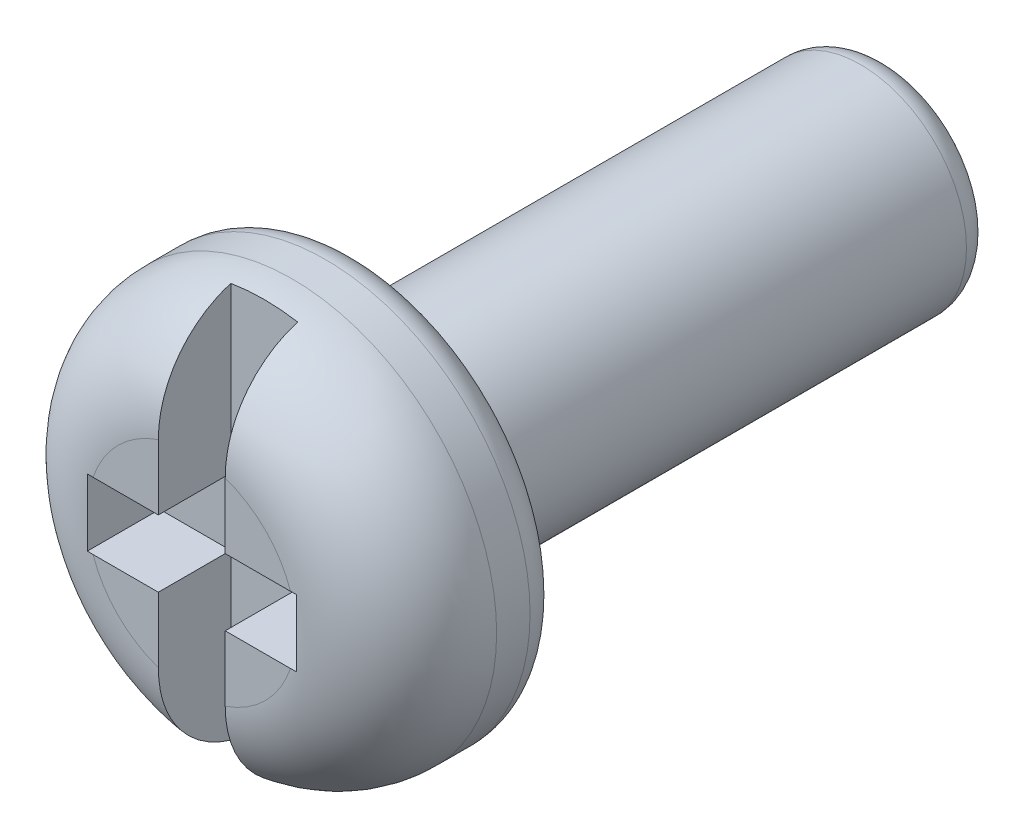
ISO-10303-21;
HEADER;
FILE_DESCRIPTION(('STEP AP214'),'2;1');
FILE_NAME('part.step','',(''),(''),'','','');
FILE_SCHEMA(('AUTOMOTIVE_DESIGN { 1 0 10303 214 1 1 1 1 }'));
ENDSEC;
DATA;
#1=APPLICATION_CONTEXT('core data for automotive mechanical design processes');
#2=APPLICATION_PROTOCOL_DEFINITION('international standard','automotive_design',2000,#1);
#3=PRODUCT_CONTEXT('',#1,'mechanical');
#4=PRODUCT('Part','Part','',(#3));
#5=PRODUCT_RELATED_PRODUCT_CATEGORY('part','',(#4));
#6=PRODUCT_DEFINITION_FORMATION('','',#4);
#7=PRODUCT_DEFINITION_CONTEXT('part definition',#1,'design');
#8=PRODUCT_DEFINITION('design','',#6,#7);
#9=PRODUCT_DEFINITION_SHAPE('','',#8);
#10=(LENGTH_UNIT() NAMED_UNIT(*) SI_UNIT(.MILLI.,.METRE.));
#11=(NAMED_UNIT(*) PLANE_ANGLE_UNIT() SI_UNIT($,.RADIAN.));
#12=(NAMED_UNIT(*) SI_UNIT($,.STERADIAN.) SOLID_ANGLE_UNIT());
#13=UNCERTAINTY_MEASURE_WITH_UNIT(LENGTH_MEASURE(1.E-05),#10,'distance_accuracy_value','');
#14=(GEOMETRIC_REPRESENTATION_CONTEXT(3) GLOBAL_UNCERTAINTY_ASSIGNED_CONTEXT((#13)) GLOBAL_UNIT_ASSIGNED_CONTEXT((#10,
#11,#12)) REPRESENTATION_CONTEXT('',''));
#15=CARTESIAN_POINT('',(0.,0.,0.));
#16=DIRECTION('',(0.,0.,1.));
#17=DIRECTION('',(1.,0.,0.));
#18=AXIS2_PLACEMENT_3D('',#15,#16,#17);
#19=CARTESIAN_POINT('',(2.38125,0.762,14.224));
#20=DIRECTION('',(0.,1.,0.));
#21=DIRECTION('',(-1.,0.,0.));
#22=AXIS2_PLACEMENT_3D('',#19,#20,#21);
#23=PLANE('',#22);
#24=DIRECTION('',(0.,0.,1.));
#25=VECTOR('',#24,1.);
#26=CARTESIAN_POINT('',(0.762000000000001,0.762,14.224));
#27=LINE('',#26,#25);
#28=CARTESIAN_POINT('',(0.762,0.762,15.875));
#29=VERTEX_POINT('',#28);
#30=CARTESIAN_POINT('',(0.762,0.762,14.224));
#31=VERTEX_POINT('',#30);
#32=EDGE_CURVE('E469',#29,#31,#27,.F.);
#33=ORIENTED_EDGE('',*,*,#32,.T.);
#34=DIRECTION('',(-1.,0.,0.));
#35=VECTOR('',#34,1.);
#36=CARTESIAN_POINT('',(-2.38125,0.762,14.224));
#37=LINE('',#36,#35);
#38=CARTESIAN_POINT('',(2.38125,0.762,14.224));
#39=VERTEX_POINT('',#38);
#40=EDGE_CURVE('E471',#31,#39,#37,.F.);
#41=ORIENTED_EDGE('',*,*,#40,.T.);
#42=DIRECTION('',(0.,0.,-1.));
#43=VECTOR('',#42,1.);
#44=CARTESIAN_POINT('',(2.38125,0.762,14.224));
#45=LINE('',#44,#43);
#46=CARTESIAN_POINT('',(2.38125,0.762,15.8715635006278));
#47=VERTEX_POINT('',#46);
#48=EDGE_CURVE('E653',#39,#47,#45,.F.);
#49=ORIENTED_EDGE('',*,*,#48,.T.);
#50=CARTESIAN_POINT('',(2.24933457048969,0.762,15.875));
#51=CARTESIAN_POINT('',(2.31552043281302,0.762,15.875));
#52=CARTESIAN_POINT('',(2.38125,0.762,15.8715635006278));
#53=B_SPLINE_CURVE_WITH_KNOTS('',2,(#50,#51,#52),.UNSPECIFIED.,.F.,.F.,(3,3),(0.,1.),.UNSPECIFIED.);
#54=CARTESIAN_POINT('',(2.24933457048969,0.762,15.875));
#55=VERTEX_POINT('',#54);
#56=EDGE_CURVE('E20',#55,#47,#53,.T.);
#57=ORIENTED_EDGE('',*,*,#56,.F.);
#58=DIRECTION('',(-1.,0.,0.));
#59=VECTOR('',#58,1.);
#60=CARTESIAN_POINT('',(-1.18745,0.762,15.875));
#61=LINE('',#60,#59);
#62=EDGE_CURVE('E473',#55,#29,#61,.T.);
#63=ORIENTED_EDGE('',*,*,#62,.T.);
#64=EDGE_LOOP('',(#33,#41,#49,#57,#63));
#65=FACE_BOUND('',#64,.T.);
#66=ADVANCED_FACE('F16',(#65),#23,.F.);
#67=CARTESIAN_POINT('',(-2.38125,-0.762,14.224));
#68=DIRECTION('',(0.,-1.,0.));
#69=DIRECTION('',(1.,0.,0.));
#70=AXIS2_PLACEMENT_3D('',#67,#68,#69);
#71=PLANE('',#70);
#72=DIRECTION('',(0.,0.,1.));
#73=VECTOR('',#72,1.);
#74=CARTESIAN_POINT('',(0.762000000000001,-0.762,14.224));
#75=LINE('',#74,#73);
#76=CARTESIAN_POINT('',(0.762000000000001,-0.762,14.224));
#77=VERTEX_POINT('',#76);
#78=CARTESIAN_POINT('',(0.762000000000001,-0.762,15.875));
#79=VERTEX_POINT('',#78);
#80=EDGE_CURVE('E566',#77,#79,#75,.T.);
#81=ORIENTED_EDGE('',*,*,#80,.T.);
#82=DIRECTION('',(-1.,0.,0.));
#83=VECTOR('',#82,1.);
#84=CARTESIAN_POINT('',(-1.18745,-0.762,15.875));
#85=LINE('',#84,#83);
#86=CARTESIAN_POINT('',(2.24933457048968,-0.762,15.875));
#87=VERTEX_POINT('',#86);
#88=EDGE_CURVE('E589',#79,#87,#85,.F.);
#89=ORIENTED_EDGE('',*,*,#88,.T.);
#90=CARTESIAN_POINT('',(2.38125,-0.762000000000003,15.8715635006272));
#91=CARTESIAN_POINT('',(2.31552043283485,-0.762000000000003,15.875));
#92=CARTESIAN_POINT('',(2.24933457048968,-0.762000000000002,15.875));
#93=B_SPLINE_CURVE_WITH_KNOTS('',2,(#90,#91,#92),.UNSPECIFIED.,.F.,.F.,(3,3),(0.,1.),.UNSPECIFIED.);
#94=CARTESIAN_POINT('',(2.38125,-0.762000000000001,15.8715635006272));
#95=VERTEX_POINT('',#94);
#96=EDGE_CURVE('E65',#95,#87,#93,.T.);
#97=ORIENTED_EDGE('',*,*,#96,.F.);
#98=DIRECTION('',(0.,0.,-1.));
#99=VECTOR('',#98,1.);
#100=CARTESIAN_POINT('',(2.38125,-0.762,14.224));
#101=LINE('',#100,#99);
#102=CARTESIAN_POINT('',(2.38125,-0.762,14.224));
#103=VERTEX_POINT('',#102);
#104=EDGE_CURVE('E586',#95,#103,#101,.T.);
#105=ORIENTED_EDGE('',*,*,#104,.T.);
#106=DIRECTION('',(-1.,0.,0.));
#107=VECTOR('',#106,1.);
#108=CARTESIAN_POINT('',(-2.38125,-0.762,14.224));
#109=LINE('',#108,#107);
#110=EDGE_CURVE('E574',#103,#77,#109,.T.);
#111=ORIENTED_EDGE('',*,*,#110,.T.);
#112=EDGE_LOOP('',(#81,#89,#97,#105,#111));
#113=FACE_BOUND('',#112,.T.);
#114=ADVANCED_FACE('F447',(#113),#71,.F.);
#115=CARTESIAN_POINT('',(-2.38125,0.762,14.224));
#116=DIRECTION('',(0.,0.,-1.));
#117=DIRECTION('',(-1.,0.,0.));
#118=AXIS2_PLACEMENT_3D('',#115,#116,#117);
#119=PLANE('',#118);
#120=DIRECTION('',(0.,1.,0.));
#121=VECTOR('',#120,1.);
#122=CARTESIAN_POINT('',(0.762,5.1054000087028,14.224));
#123=LINE('',#122,#121);
#124=CARTESIAN_POINT('',(0.762,4.50697297927666,14.224));
#125=VERTEX_POINT('',#124);
#126=EDGE_CURVE('E476',#31,#125,#123,.T.);
#127=ORIENTED_EDGE('',*,*,#126,.T.);
#128=CARTESIAN_POINT('',(0.,0.,14.224));
#129=DIRECTION('',(0.,0.,-1.));
#130=DIRECTION('',(-1.,0.,0.));
#131=AXIS2_PLACEMENT_3D('',#128,#129,#130);
#132=CIRCLE('',#131,4.5709352911554);
#133=CARTESIAN_POINT('',(-0.762,4.50697297927666,14.224));
#134=VERTEX_POINT('',#133);
#135=EDGE_CURVE('E485',#134,#125,#132,.T.);
#136=ORIENTED_EDGE('',*,*,#135,.F.);
#137=DIRECTION('',(0.,-1.,0.));
#138=VECTOR('',#137,1.);
#139=CARTESIAN_POINT('',(-0.762,5.1054000087028,14.224));
#140=LINE('',#139,#138);
#141=CARTESIAN_POINT('',(-0.762,0.762,14.224));
#142=VERTEX_POINT('',#141);
#143=EDGE_CURVE('E503',#134,#142,#140,.T.);
#144=ORIENTED_EDGE('',*,*,#143,.T.);
#145=DIRECTION('',(-1.,0.,0.));
#146=VECTOR('',#145,1.);
#147=CARTESIAN_POINT('',(2.38125,0.762,14.224));
#148=LINE('',#147,#146);
#149=CARTESIAN_POINT('',(-2.38125,0.762,14.224));
#150=VERTEX_POINT('',#149);
#151=EDGE_CURVE('E201',#142,#150,#148,.T.);
#152=ORIENTED_EDGE('',*,*,#151,.T.);
#153=DIRECTION('',(0.,1.,0.));
#154=VECTOR('',#153,1.);
#155=CARTESIAN_POINT('',(-2.38125,0.762,14.224));
#156=LINE('',#155,#154);
#157=CARTESIAN_POINT('',(-2.38125,-0.762,14.224));
#158=VERTEX_POINT('',#157);
#159=EDGE_CURVE('E206',#158,#150,#156,.T.);
#160=ORIENTED_EDGE('',*,*,#159,.F.);
#161=DIRECTION('',(1.,0.,0.));
#162=VECTOR('',#161,1.);
#163=CARTESIAN_POINT('',(-2.38125,-0.762,14.224));
#164=LINE('',#163,#162);
#165=CARTESIAN_POINT('',(-0.762,-0.762,14.224));
#166=VERTEX_POINT('',#165);
#167=EDGE_CURVE('E532',#158,#166,#164,.T.);
#168=ORIENTED_EDGE('',*,*,#167,.T.);
#169=DIRECTION('',(0.,-1.,0.));
#170=VECTOR('',#169,1.);
#171=CARTESIAN_POINT('',(-0.762,5.1054000087028,14.224));
#172=LINE('',#171,#170);
#173=CARTESIAN_POINT('',(-0.761999999999999,-4.50697297927666,14.224));
#174=VERTEX_POINT('',#173);
#175=EDGE_CURVE('E562',#166,#174,#172,.T.);
#176=ORIENTED_EDGE('',*,*,#175,.T.);
#177=CARTESIAN_POINT('',(0.,0.,14.224));
#178=DIRECTION('',(0.,0.,-1.));
#179=DIRECTION('',(-1.,0.,0.));
#180=AXIS2_PLACEMENT_3D('',#177,#178,#179);
#181=CIRCLE('',#180,4.5709352911554);
#182=CARTESIAN_POINT('',(0.762000000000001,-4.50697297927666,14.224));
#183=VERTEX_POINT('',#182);
#184=EDGE_CURVE('E152',#183,#174,#181,.T.);
#185=ORIENTED_EDGE('',*,*,#184,.F.);
#186=DIRECTION('',(0.,1.,0.));
#187=VECTOR('',#186,1.);
#188=CARTESIAN_POINT('',(0.762,5.1054000087028,14.224));
#189=LINE('',#188,#187);
#190=EDGE_CURVE('E568',#183,#77,#189,.T.);
#191=ORIENTED_EDGE('',*,*,#190,.T.);
#192=ORIENTED_EDGE('',*,*,#110,.F.);
#193=DIRECTION('',(0.,1.,0.));
#194=VECTOR('',#193,1.);
#195=CARTESIAN_POINT('',(2.38125,-0.762,14.224));
#196=LINE('',#195,#194);
#197=EDGE_CURVE('E483',#103,#39,#196,.T.);
#198=ORIENTED_EDGE('',*,*,#197,.T.);
#199=ORIENTED_EDGE('',*,*,#40,.F.);
#200=EDGE_LOOP('',(#127,#136,#144,#152,#160,#168,#176,#185,#191,#192,#198,#199));
#201=FACE_BOUND('',#200,.T.);
#202=ADVANCED_FACE('F438',(#201),#119,.F.);
#203=CARTESIAN_POINT('',(2.38125,0.762,14.224));
#204=DIRECTION('',(0.,1.,0.));
#205=DIRECTION('',(-1.,0.,0.));
#206=AXIS2_PLACEMENT_3D('',#203,#204,#205);
#207=PLANE('',#206);
#208=DIRECTION('',(0.,0.,1.));
#209=VECTOR('',#208,1.);
#210=CARTESIAN_POINT('',(-0.762,0.762,14.224));
#211=LINE('',#210,#209);
#212=CARTESIAN_POINT('',(-0.762,0.762,15.875));
#213=VERTEX_POINT('',#212);
#214=EDGE_CURVE('E500',#142,#213,#211,.T.);
#215=ORIENTED_EDGE('',*,*,#214,.T.);
#216=DIRECTION('',(-1.,0.,0.));
#217=VECTOR('',#216,1.);
#218=CARTESIAN_POINT('',(-1.18745,0.762,15.875));
#219=LINE('',#218,#217);
#220=CARTESIAN_POINT('',(-2.24933457048969,0.762,15.875));
#221=VERTEX_POINT('',#220);
#222=EDGE_CURVE('E505',#213,#221,#219,.T.);
#223=ORIENTED_EDGE('',*,*,#222,.T.);
#224=CARTESIAN_POINT('',(-2.38125,0.762,15.8715635006268));
#225=CARTESIAN_POINT('',(-2.31552043285017,0.762,15.875));
#226=CARTESIAN_POINT('',(-2.24933457048969,0.762,15.875));
#227=B_SPLINE_CURVE_WITH_KNOTS('',2,(#224,#225,#226),.UNSPECIFIED.,.F.,.F.,(3,3),(0.,1.),.UNSPECIFIED.);
#228=CARTESIAN_POINT('',(-2.38125,0.762,15.8715635006268));
#229=VERTEX_POINT('',#228);
#230=EDGE_CURVE('E36',#229,#221,#227,.T.);
#231=ORIENTED_EDGE('',*,*,#230,.F.);
#232=DIRECTION('',(0.,0.,1.));
#233=VECTOR('',#232,1.);
#234=CARTESIAN_POINT('',(-2.38125,0.762,14.224));
#235=LINE('',#234,#233);
#236=EDGE_CURVE('E138',#229,#150,#235,.F.);
#237=ORIENTED_EDGE('',*,*,#236,.T.);
#238=ORIENTED_EDGE('',*,*,#151,.F.);
#239=EDGE_LOOP('',(#215,#223,#231,#237,#238));
#240=FACE_BOUND('',#239,.T.);
#241=ADVANCED_FACE('F199',(#240),#207,.F.);
#242=CARTESIAN_POINT('',(-2.38125,-0.762,14.224));
#243=DIRECTION('',(0.,-1.,0.));
#244=DIRECTION('',(1.,0.,0.));
#245=AXIS2_PLACEMENT_3D('',#242,#243,#244);
#246=PLANE('',#245);
#247=DIRECTION('',(0.,0.,1.));
#248=VECTOR('',#247,1.);
#249=CARTESIAN_POINT('',(-0.761999999999999,-0.762,14.224));
#250=LINE('',#249,#248);
#251=CARTESIAN_POINT('',(-0.762,-0.762,15.875));
#252=VERTEX_POINT('',#251);
#253=EDGE_CURVE('E135',#252,#166,#250,.F.);
#254=ORIENTED_EDGE('',*,*,#253,.T.);
#255=ORIENTED_EDGE('',*,*,#167,.F.);
#256=DIRECTION('',(0.,0.,1.));
#257=VECTOR('',#256,1.);
#258=CARTESIAN_POINT('',(-2.38125,-0.762,14.224));
#259=LINE('',#258,#257);
#260=CARTESIAN_POINT('',(-2.38125,-0.762,15.8715635006278));
#261=VERTEX_POINT('',#260);
#262=EDGE_CURVE('E191',#158,#261,#259,.T.);
#263=ORIENTED_EDGE('',*,*,#262,.T.);
#264=CARTESIAN_POINT('',(-2.24933457048969,-0.762,15.875));
#265=CARTESIAN_POINT('',(-2.31552043281302,-0.762,15.875));
#266=CARTESIAN_POINT('',(-2.38125,-0.762,15.8715635006278));
#267=B_SPLINE_CURVE_WITH_KNOTS('',2,(#264,#265,#266),.UNSPECIFIED.,.F.,.F.,(3,3),(0.,1.),.UNSPECIFIED.);
#268=CARTESIAN_POINT('',(-2.24933457048969,-0.762,15.875));
#269=VERTEX_POINT('',#268);
#270=EDGE_CURVE('E208',#269,#261,#267,.T.);
#271=ORIENTED_EDGE('',*,*,#270,.F.);
#272=DIRECTION('',(-1.,0.,0.));
#273=VECTOR('',#272,1.);
#274=CARTESIAN_POINT('',(-1.18745,-0.762,15.875));
#275=LINE('',#274,#273);
#276=EDGE_CURVE('E139',#269,#252,#275,.F.);
#277=ORIENTED_EDGE('',*,*,#276,.T.);
#278=EDGE_LOOP('',(#254,#255,#263,#271,#277));
#279=FACE_BOUND('',#278,.T.);
#280=ADVANCED_FACE('F419',(#279),#246,.F.);
#281=CARTESIAN_POINT('',(-1.18745,0.,15.875));
#282=DIRECTION('',(0.,0.,-1.));
#283=DIRECTION('',(-1.,0.,0.));
#284=AXIS2_PLACEMENT_3D('',#281,#282,#283);
#285=PLANE('',#284);
#286=DIRECTION('',(0.,-1.,0.));
#287=VECTOR('',#286,1.);
#288=CARTESIAN_POINT('',(-0.762,5.1054000087028,15.875));
#289=LINE('',#288,#287);
#290=CARTESIAN_POINT('',(-0.762,2.24933457048969,15.875));
#291=VERTEX_POINT('',#290);
#292=EDGE_CURVE('E477',#213,#291,#289,.F.);
#293=ORIENTED_EDGE('',*,*,#292,.T.);
#294=CARTESIAN_POINT('',(0.,0.,15.875));
#295=DIRECTION('',(0.,0.,-1.));
#296=DIRECTION('',(-0.947128119284889,0.320855614973261,0.));
#297=AXIS2_PLACEMENT_3D('',#294,#295,#296);
#298=CIRCLE('',#297,2.37490000000001);
#299=EDGE_CURVE('E194',#221,#291,#298,.T.);
#300=ORIENTED_EDGE('',*,*,#299,.F.);
#301=ORIENTED_EDGE('',*,*,#222,.F.);
#302=EDGE_LOOP('',(#293,#300,#301));
#303=FACE_BOUND('',#302,.T.);
#304=ADVANCED_FACE('F409',(#303),#285,.F.);
#305=CARTESIAN_POINT('',(-0.762,5.1054000087028,14.224));
#306=DIRECTION('',(-1.,0.,0.));
#307=DIRECTION('',(0.,-1.,0.));
#308=AXIS2_PLACEMENT_3D('',#305,#306,#307);
#309=PLANE('',#308);
#310=ORIENTED_EDGE('',*,*,#214,.F.);
#311=ORIENTED_EDGE('',*,*,#143,.F.);
#312=CARTESIAN_POINT('',(-0.762,2.24933457048969,15.875));
#313=CARTESIAN_POINT('',(-0.761999999999998,2.31857015286448,15.8750120063341));
#314=CARTESIAN_POINT('',(-0.761999999999999,2.38781373559717,15.8721780318991));
#315=CARTESIAN_POINT('',(-0.762,2.52584179413332,15.8607469620337));
#316=CARTESIAN_POINT('',(-0.762000000000001,2.59462613415144,15.8521482322549));
#317=CARTESIAN_POINT('',(-0.761999999999998,2.73128839722187,15.8291050021387));
#318=CARTESIAN_POINT('',(-0.761999999999994,2.79916535521893,15.814654721312));
#319=CARTESIAN_POINT('',(-0.762000000000005,2.93338925925472,15.7799454931923));
#320=CARTESIAN_POINT('',(-0.76200000000002,2.999736388021,15.7596872435449));
#321=CARTESIAN_POINT('',(-0.762000000000036,3.19486590753159,15.6905844293292));
#322=CARTESIAN_POINT('',(-0.762000000000009,3.32076412595768,15.6332392729572));
#323=CARTESIAN_POINT('',(-0.76199999999999,3.56028532532934,15.4972791539692));
#324=CARTESIAN_POINT('',(-0.761999999999998,3.67391984980217,15.4186844417406));
#325=CARTESIAN_POINT('',(-0.762000000000003,3.88037191248349,15.2466129224533));
#326=CARTESIAN_POINT('',(-0.762000000000001,3.9739159123031,15.1540071749996));
#327=CARTESIAN_POINT('',(-0.761999999999999,4.14372667341,14.9540889309037));
#328=CARTESIAN_POINT('',(-0.761999999999999,4.21999715174322,14.8467796062797));
#329=CARTESIAN_POINT('',(-0.762,4.33347482681577,14.6536749411664));
#330=CARTESIAN_POINT('',(-0.762,4.37558906742209,14.5707191927778));
#331=CARTESIAN_POINT('',(-0.762,4.44928763424628,14.4003927815324));
#332=CARTESIAN_POINT('',(-0.762,4.48088644294263,14.3130283832416));
#333=CARTESIAN_POINT('',(-0.761999999999999,4.50697297927666,14.224));
#334=B_SPLINE_CURVE_WITH_KNOTS('',3,(#312,#313,#314,#315,#316,#317,#318,#319,#320,#321,#322,
#323,#324,#325,#326,#327,#328,#329,#330,#331,#332,#333),.UNSPECIFIED.,.F.,.F.,(4,2,2,2,2,2,2,2,
2,2,4),(0.,0.207658951127346,0.415376799928397,0.623300346562895,0.831198928149645,
1.24391190440976,1.65623295165278,2.04921222065782,2.44210684491622,2.72054351489304,
2.9985951027217),.UNSPECIFIED.);
#335=EDGE_CURVE('E629',#291,#134,#334,.T.);
#336=ORIENTED_EDGE('',*,*,#335,.F.);
#337=ORIENTED_EDGE('',*,*,#292,.F.);
#338=EDGE_LOOP('',(#310,#311,#336,#337));
#339=FACE_BOUND('',#338,.T.);
#340=ADVANCED_FACE('F399',(#339),#309,.F.);
#341=CARTESIAN_POINT('',(0.762,5.1054000087028,14.224));
#342=DIRECTION('',(1.,0.,0.));
#343=DIRECTION('',(0.,1.,0.));
#344=AXIS2_PLACEMENT_3D('',#341,#342,#343);
#345=PLANE('',#344);
#346=ORIENTED_EDGE('',*,*,#32,.F.);
#347=DIRECTION('',(0.,1.,0.));
#348=VECTOR('',#347,1.);
#349=CARTESIAN_POINT('',(0.762,0.,15.875));
#350=LINE('',#349,#348);
#351=CARTESIAN_POINT('',(0.762,2.24933457048969,15.875));
#352=VERTEX_POINT('',#351);
#353=EDGE_CURVE('E490',#29,#352,#350,.T.);
#354=ORIENTED_EDGE('',*,*,#353,.T.);
#355=CARTESIAN_POINT('',(0.762000000000001,4.50697297927666,14.224));
#356=CARTESIAN_POINT('',(0.762,4.48899482082664,14.2853274901749));
#357=CARTESIAN_POINT('',(0.762,4.46840287735233,14.3458847021477));
#358=CARTESIAN_POINT('',(0.762,4.42217393073777,14.4650361233278));
#359=CARTESIAN_POINT('',(0.762,4.39653735872725,14.5236304997848));
#360=CARTESIAN_POINT('',(0.762,4.3404209641194,14.638398546594));
#361=CARTESIAN_POINT('',(0.762,4.30994502843977,14.6945741140621));
#362=CARTESIAN_POINT('',(0.762,4.24438025078716,14.8041445333258));
#363=CARTESIAN_POINT('',(0.762000000000001,4.2092914278917,14.8575393966204));
#364=CARTESIAN_POINT('',(0.762000000000001,4.09745185862946,15.0130115466413));
#365=CARTESIAN_POINT('',(0.762,4.01409082578964,15.1104521991613));
#366=CARTESIAN_POINT('',(0.762000000000001,3.83238605029267,15.2899905473715));
#367=CARTESIAN_POINT('',(0.762000000000002,3.73404782650669,15.3720938699274));
#368=CARTESIAN_POINT('',(0.762000000000003,3.52434838325627,15.5195331992913));
#369=CARTESIAN_POINT('',(0.762000000000001,3.41289111019372,15.5847327073837));
#370=CARTESIAN_POINT('',(0.762,3.18073308594454,15.6959797700354));
#371=CARTESIAN_POINT('',(0.762000000000001,3.06002636532825,15.742014830815));
#372=CARTESIAN_POINT('',(0.762000000000001,2.82488469403238,15.8105081654999));
#373=CARTESIAN_POINT('',(0.762,2.71099085898578,15.8348318927297));
#374=CARTESIAN_POINT('',(0.762,2.53860890318799,15.8590162958514));
#375=CARTESIAN_POINT('',(0.762,2.48092060869738,15.8650276290919));
#376=CARTESIAN_POINT('',(0.762,2.36527087737749,15.873020431787));
#377=CARTESIAN_POINT('',(0.762000000000001,2.30730947069498,15.8750023360373));
#378=CARTESIAN_POINT('',(0.762000000000001,2.24933457048969,15.875));
#379=B_SPLINE_CURVE_WITH_KNOTS('',3,(#355,#356,#357,#358,#359,#360,#361,#362,#363,#364,#365,
#366,#367,#368,#369,#370,#371,#372,#373,#374,#375,#376,#377,#378),.UNSPECIFIED.,.F.,.F.,(4,2,2,
2,2,2,2,2,2,2,2,4),(0.,0.191660933878234,0.383305494922878,0.574796900806049,0.766287514762521,
1.1490186275538,1.53160904934273,1.91719890439149,2.30303974288341,2.65114636519203,
2.82502590749426,2.99888668632189),.UNSPECIFIED.);
#380=EDGE_CURVE('E488',#125,#352,#379,.T.);
#381=ORIENTED_EDGE('',*,*,#380,.F.);
#382=ORIENTED_EDGE('',*,*,#126,.F.);
#383=EDGE_LOOP('',(#346,#354,#381,#382));
#384=FACE_BOUND('',#383,.T.);
#385=ADVANCED_FACE('F389',(#384),#345,.F.);
#386=CARTESIAN_POINT('',(-1.18745,0.,15.875));
#387=DIRECTION('',(0.,0.,-1.));
#388=DIRECTION('',(-1.,0.,0.));
#389=AXIS2_PLACEMENT_3D('',#386,#387,#388);
#390=PLANE('',#389);
#391=ORIENTED_EDGE('',*,*,#353,.F.);
#392=ORIENTED_EDGE('',*,*,#62,.F.);
#393=CARTESIAN_POINT('',(0.,0.,15.875));
#394=DIRECTION('',(0.,0.,-1.));
#395=DIRECTION('',(0.320855614973261,0.947128119284889,0.));
#396=AXIS2_PLACEMENT_3D('',#393,#394,#395);
#397=CIRCLE('',#396,2.37490000000001);
#398=EDGE_CURVE('E623',#352,#55,#397,.T.);
#399=ORIENTED_EDGE('',*,*,#398,.F.);
#400=EDGE_LOOP('',(#391,#392,#399));
#401=FACE_BOUND('',#400,.T.);
#402=ADVANCED_FACE('F379',(#401),#390,.F.);
#403=CARTESIAN_POINT('',(2.38125,-0.762,14.224));
#404=DIRECTION('',(1.,0.,0.));
#405=DIRECTION('',(0.,0.,-1.));
#406=AXIS2_PLACEMENT_3D('',#403,#404,#405);
#407=PLANE('',#406);
#408=ORIENTED_EDGE('',*,*,#48,.F.);
#409=ORIENTED_EDGE('',*,*,#197,.F.);
#410=ORIENTED_EDGE('',*,*,#104,.F.);
#411=CARTESIAN_POINT('',(2.38125,0.761999999999982,15.8715635006268));
#412=CARTESIAN_POINT('',(2.38125,0.69850454019341,15.8726141738095));
#413=CARTESIAN_POINT('',(2.38125,0.635005433680503,15.8733198631581));
#414=CARTESIAN_POINT('',(2.38125,0.508005084788024,15.8742859278826));
#415=CARTESIAN_POINT('',(2.38125,0.444503842497386,15.8745463140397));
#416=CARTESIAN_POINT('',(2.38125,0.317502433039196,15.8748664504141));
#417=CARTESIAN_POINT('',(2.38125,0.254002265872591,15.8749262041967));
#418=CARTESIAN_POINT('',(2.38125,0.127001399137652,15.8749885694779));
#419=CARTESIAN_POINT('',(2.38125,0.0635006995688236,15.8749911805584));
#420=CARTESIAN_POINT('',(2.38125,-0.0635006995688343,15.8749911805584));
#421=CARTESIAN_POINT('',(2.38125,-0.127001399137663,15.8749885694779));
#422=CARTESIAN_POINT('',(2.38125,-0.254002265872601,15.8749262041967));
#423=CARTESIAN_POINT('',(2.38125,-0.317502433039207,15.8748664504141));
#424=CARTESIAN_POINT('',(2.38125,-0.444503842497397,15.8745463140397));
#425=CARTESIAN_POINT('',(2.38125,-0.508005084788035,15.8742859278826));
#426=CARTESIAN_POINT('',(2.38125,-0.635005433680514,15.8733198631581));
#427=CARTESIAN_POINT('',(2.38125,-0.69850454019342,15.8726141738095));
#428=CARTESIAN_POINT('',(2.38125,-0.761999999999993,15.8715635006268));
#429=B_SPLINE_CURVE_WITH_KNOTS('',3,(#411,#412,#413,#414,#415,#416,#417,#418,#419,#420,#421,
#422,#423,#424,#425,#426,#427,#428),.UNSPECIFIED.,.F.,.F.,(4,2,2,2,2,2,2,2,4),(0.,
0.190508671850208,0.381012731235381,0.571513405382453,0.762015473155972,0.952517540929491,
1.14301821507656,1.33352227446174,1.52403094631194),.UNSPECIFIED.);
#430=EDGE_CURVE('E618',#47,#95,#429,.T.);
#431=ORIENTED_EDGE('',*,*,#430,.F.);
#432=EDGE_LOOP('',(#408,#409,#410,#431));
#433=FACE_BOUND('',#432,.T.);
#434=ADVANCED_FACE('F369',(#433),#407,.F.);
#435=CARTESIAN_POINT('',(-1.18745,0.,15.875));
#436=DIRECTION('',(0.,0.,-1.));
#437=DIRECTION('',(-1.,0.,0.));
#438=AXIS2_PLACEMENT_3D('',#435,#436,#437);
#439=PLANE('',#438);
#440=DIRECTION('',(0.,1.,0.));
#441=VECTOR('',#440,1.);
#442=CARTESIAN_POINT('',(0.762,5.1054000087028,15.875));
#443=LINE('',#442,#441);
#444=CARTESIAN_POINT('',(0.762,-2.24933457048969,15.875));
#445=VERTEX_POINT('',#444);
#446=EDGE_CURVE('E563',#79,#445,#443,.F.);
#447=ORIENTED_EDGE('',*,*,#446,.T.);
#448=CARTESIAN_POINT('',(0.,0.,15.875));
#449=DIRECTION('',(0.,0.,-1.));
#450=DIRECTION('',(0.947128119284889,-0.320855614973262,0.));
#451=AXIS2_PLACEMENT_3D('',#448,#449,#450);
#452=CIRCLE('',#451,2.3749);
#453=EDGE_CURVE('E156',#87,#445,#452,.T.);
#454=ORIENTED_EDGE('',*,*,#453,.F.);
#455=ORIENTED_EDGE('',*,*,#88,.F.);
#456=EDGE_LOOP('',(#447,#454,#455));
#457=FACE_BOUND('',#456,.T.);
#458=ADVANCED_FACE('F360',(#457),#439,.F.);
#459=CARTESIAN_POINT('',(0.762,5.1054000087028,14.224));
#460=DIRECTION('',(1.,0.,0.));
#461=DIRECTION('',(0.,1.,0.));
#462=AXIS2_PLACEMENT_3D('',#459,#460,#461);
#463=PLANE('',#462);
#464=ORIENTED_EDGE('',*,*,#80,.F.);
#465=ORIENTED_EDGE('',*,*,#190,.F.);
#466=CARTESIAN_POINT('',(0.762000000000002,-2.24933457048969,15.875));
#467=CARTESIAN_POINT('',(0.762,-2.31857015286448,15.8750120063341));
#468=CARTESIAN_POINT('',(0.762,-2.38781373559717,15.8721780318991));
#469=CARTESIAN_POINT('',(0.762000000000002,-2.52584179413332,15.8607469620337));
#470=CARTESIAN_POINT('',(0.762000000000002,-2.59462613415144,15.8521482322549));
#471=CARTESIAN_POINT('',(0.762,-2.73128839722187,15.8291050021387));
#472=CARTESIAN_POINT('',(0.761999999999996,-2.79916535521893,15.814654721312));
#473=CARTESIAN_POINT('',(0.762000000000006,-2.93338925925472,15.7799454931923));
#474=CARTESIAN_POINT('',(0.76200000000002,-2.999736388021,15.7596872435449));
#475=CARTESIAN_POINT('',(0.762000000000035,-3.19486590753159,15.6905844293292));
#476=CARTESIAN_POINT('',(0.76200000000001,-3.32076412595768,15.6332392729572));
#477=CARTESIAN_POINT('',(0.761999999999992,-3.56028532532934,15.4972791539692));
#478=CARTESIAN_POINT('',(0.762,-3.67391984980217,15.4186844417406));
#479=CARTESIAN_POINT('',(0.762000000000005,-3.88037191248349,15.2466129224533));
#480=CARTESIAN_POINT('',(0.762000000000003,-3.9739159123031,15.1540071749996));
#481=CARTESIAN_POINT('',(0.762,-4.14372667341,14.9540889309037));
#482=CARTESIAN_POINT('',(0.761999999999999,-4.21999715174323,14.8467796062797));
#483=CARTESIAN_POINT('',(0.762,-4.33347482681577,14.6536749411664));
#484=CARTESIAN_POINT('',(0.762000000000001,-4.37558906742209,14.5707191927778));
#485=CARTESIAN_POINT('',(0.762000000000002,-4.44928763424628,14.4003927815324));
#486=CARTESIAN_POINT('',(0.762000000000003,-4.48088644294262,14.3130283832416));
#487=CARTESIAN_POINT('',(0.762000000000003,-4.50697297927666,14.224));
#488=B_SPLINE_CURVE_WITH_KNOTS('',3,(#466,#467,#468,#469,#470,#471,#472,#473,#474,#475,#476,
#477,#478,#479,#480,#481,#482,#483,#484,#485,#486,#487),.UNSPECIFIED.,.F.,.F.,(4,2,2,2,2,2,2,2,
2,2,4),(0.,0.207658951127346,0.415376799928398,0.623300346562896,0.831198928149647,
1.24391190440976,1.65623295165279,2.04921222065783,2.44210684491622,2.72054351489304,
2.9985951027217),.UNSPECIFIED.);
#489=EDGE_CURVE('E154',#445,#183,#488,.T.);
#490=ORIENTED_EDGE('',*,*,#489,.F.);
#491=ORIENTED_EDGE('',*,*,#446,.F.);
#492=EDGE_LOOP('',(#464,#465,#490,#491));
#493=FACE_BOUND('',#492,.T.);
#494=ADVANCED_FACE('F352',(#493),#463,.F.);
#495=CARTESIAN_POINT('',(-0.762,5.1054000087028,14.224));
#496=DIRECTION('',(-1.,0.,0.));
#497=DIRECTION('',(0.,-1.,0.));
#498=AXIS2_PLACEMENT_3D('',#495,#496,#497);
#499=PLANE('',#498);
#500=ORIENTED_EDGE('',*,*,#253,.F.);
#501=DIRECTION('',(0.,1.,0.));
#502=VECTOR('',#501,1.);
#503=CARTESIAN_POINT('',(-0.762,0.,15.875));
#504=LINE('',#503,#502);
#505=CARTESIAN_POINT('',(-0.762,-2.24933457048969,15.875));
#506=VERTEX_POINT('',#505);
#507=EDGE_CURVE('E128',#252,#506,#504,.F.);
#508=ORIENTED_EDGE('',*,*,#507,.T.);
#509=CARTESIAN_POINT('',(-0.761999999999997,-4.50697297927666,14.224));
#510=CARTESIAN_POINT('',(-0.761999999999998,-4.48899482082664,14.2853274901749));
#511=CARTESIAN_POINT('',(-0.761999999999999,-4.46840287735233,14.3458847021477));
#512=CARTESIAN_POINT('',(-0.761999999999999,-4.42217393073778,14.4650361233278));
#513=CARTESIAN_POINT('',(-0.761999999999999,-4.39653735872725,14.5236304997848));
#514=CARTESIAN_POINT('',(-0.761999999999999,-4.3404209641194,14.638398546594));
#515=CARTESIAN_POINT('',(-0.761999999999998,-4.30994502843977,14.6945741140621));
#516=CARTESIAN_POINT('',(-0.762,-4.24438025078715,14.8041445333258));
#517=CARTESIAN_POINT('',(-0.762000000000001,-4.2092914278917,14.8575393966204));
#518=CARTESIAN_POINT('',(-0.762000000000003,-4.09745185862946,15.0130115466413));
#519=CARTESIAN_POINT('',(-0.762,-4.01409082578963,15.1104521991613));
#520=CARTESIAN_POINT('',(-0.761999999999998,-3.83238605029267,15.2899905473715));
#521=CARTESIAN_POINT('',(-0.761999999999999,-3.73404782650669,15.3720938699274));
#522=CARTESIAN_POINT('',(-0.762,-3.52434838325627,15.5195331992913));
#523=CARTESIAN_POINT('',(-0.762,-3.41289111019372,15.5847327073837));
#524=CARTESIAN_POINT('',(-0.761999999999998,-3.18073308594454,15.6959797700354));
#525=CARTESIAN_POINT('',(-0.761999999999997,-3.06002636532825,15.742014830815));
#526=CARTESIAN_POINT('',(-0.761999999999998,-2.82488469403238,15.8105081654999));
#527=CARTESIAN_POINT('',(-0.761999999999999,-2.71099085898578,15.8348318927297));
#528=CARTESIAN_POINT('',(-0.761999999999999,-2.53860890318799,15.8590162958514));
#529=CARTESIAN_POINT('',(-0.761999999999999,-2.48092060869738,15.8650276290919));
#530=CARTESIAN_POINT('',(-0.761999999999999,-2.36527087737749,15.873020431787));
#531=CARTESIAN_POINT('',(-0.761999999999999,-2.30730947069498,15.8750023360373));
#532=CARTESIAN_POINT('',(-0.761999999999999,-2.24933457048969,15.875));
#533=B_SPLINE_CURVE_WITH_KNOTS('',3,(#509,#510,#511,#512,#513,#514,#515,#516,#517,#518,#519,
#520,#521,#522,#523,#524,#525,#526,#527,#528,#529,#530,#531,#532),.UNSPECIFIED.,.F.,.F.,(4,2,2,
2,2,2,2,2,2,2,2,4),(0.,0.191660933878236,0.383305494922879,0.574796900806054,0.766287514762523,
1.1490186275538,1.53160904934273,1.91719890439149,2.30303974288342,2.65114636519203,
2.82502590749426,2.99888668632189),.UNSPECIFIED.);
#534=EDGE_CURVE('E133',#174,#506,#533,.T.);
#535=ORIENTED_EDGE('',*,*,#534,.F.);
#536=ORIENTED_EDGE('',*,*,#175,.F.);
#537=EDGE_LOOP('',(#500,#508,#535,#536));
#538=FACE_BOUND('',#537,.T.);
#539=ADVANCED_FACE('F130',(#538),#499,.F.);
#540=CARTESIAN_POINT('',(-1.18745,0.,15.875));
#541=DIRECTION('',(0.,0.,-1.));
#542=DIRECTION('',(-1.,0.,0.));
#543=AXIS2_PLACEMENT_3D('',#540,#541,#542);
#544=PLANE('',#543);
#545=ORIENTED_EDGE('',*,*,#507,.F.);
#546=ORIENTED_EDGE('',*,*,#276,.F.);
#547=CARTESIAN_POINT('',(0.,0.,15.875));
#548=DIRECTION('',(0.,0.,-1.));
#549=DIRECTION('',(-0.320855614973261,-0.947128119284889,0.));
#550=AXIS2_PLACEMENT_3D('',#547,#548,#549);
#551=CIRCLE('',#550,2.37490000000001);
#552=EDGE_CURVE('E142',#506,#269,#551,.T.);
#553=ORIENTED_EDGE('',*,*,#552,.F.);
#554=EDGE_LOOP('',(#545,#546,#553));
#555=FACE_BOUND('',#554,.T.);
#556=ADVANCED_FACE('F144',(#555),#544,.F.);
#557=CARTESIAN_POINT('',(-2.38125,0.762,14.224));
#558=DIRECTION('',(-1.,0.,0.));
#559=DIRECTION('',(0.,0.,1.));
#560=AXIS2_PLACEMENT_3D('',#557,#558,#559);
#561=PLANE('',#560);
#562=ORIENTED_EDGE('',*,*,#262,.F.);
#563=ORIENTED_EDGE('',*,*,#159,.T.);
#564=ORIENTED_EDGE('',*,*,#236,.F.);
#565=CARTESIAN_POINT('',(-2.38125,-0.761999999999983,15.8715635006268));
#566=CARTESIAN_POINT('',(-2.38125,-0.69850454019341,15.8726141738095));
#567=CARTESIAN_POINT('',(-2.38125,-0.635005433680503,15.8733198631581));
#568=CARTESIAN_POINT('',(-2.38125,-0.508005084788023,15.8742859278826));
#569=CARTESIAN_POINT('',(-2.38125,-0.444503842497385,15.8745463140397));
#570=CARTESIAN_POINT('',(-2.38125,-0.317502433039194,15.8748664504141));
#571=CARTESIAN_POINT('',(-2.38125,-0.254002265872588,15.8749262041967));
#572=CARTESIAN_POINT('',(-2.38125,-0.12700139913765,15.8749885694779));
#573=CARTESIAN_POINT('',(-2.38125,-0.0635006995688204,15.8749911805584));
#574=CARTESIAN_POINT('',(-2.38125,0.0635006995688382,15.8749911805584));
#575=CARTESIAN_POINT('',(-2.38125,0.127001399137667,15.8749885694779));
#576=CARTESIAN_POINT('',(-2.38125,0.254002265872606,15.8749262041967));
#577=CARTESIAN_POINT('',(-2.38125,0.317502433039212,15.8748664504141));
#578=CARTESIAN_POINT('',(-2.38125,0.444503842497403,15.8745463140397));
#579=CARTESIAN_POINT('',(-2.38125,0.508005084788041,15.8742859278826));
#580=CARTESIAN_POINT('',(-2.38125,0.63500543368052,15.8733198631581));
#581=CARTESIAN_POINT('',(-2.38125,0.698504540193427,15.8726141738095));
#582=CARTESIAN_POINT('',(-2.38125,0.762000000000001,15.8715635006268));
#583=B_SPLINE_CURVE_WITH_KNOTS('',3,(#565,#566,#567,#568,#569,#570,#571,#572,#573,#574,#575,
#576,#577,#578,#579,#580,#581,#582),.UNSPECIFIED.,.F.,.F.,(4,2,2,2,2,2,2,2,4),(0.,
0.190508671850209,0.381012731235383,0.571513405382456,0.762015473155976,0.952517540929496,
1.14301821507657,1.33352227446174,1.52403094631195),.UNSPECIFIED.);
#584=EDGE_CURVE('E146',#261,#229,#583,.T.);
#585=ORIENTED_EDGE('',*,*,#584,.F.);
#586=EDGE_LOOP('',(#562,#563,#564,#585));
#587=FACE_BOUND('',#586,.T.);
#588=ADVANCED_FACE('F179',(#587),#561,.F.);
#589=CARTESIAN_POINT('',(0.,0.,13.589));
#590=DIRECTION('',(0.,0.,-1.));
#591=DIRECTION('',(-1.,0.,0.));
#592=AXIS2_PLACEMENT_3D('',#589,#590,#591);
#593=TOROIDAL_SURFACE('',#592,2.3749,2.286);
#594=CARTESIAN_POINT('',(0.,0.,13.589));
#595=DIRECTION('',(0.,0.,1.));
#596=DIRECTION('',(1.,0.,0.));
#597=AXIS2_PLACEMENT_3D('',#594,#595,#596);
#598=CIRCLE('',#597,4.6609);
#599=CARTESIAN_POINT('',(4.6609,0.,13.589));
#600=VERTEX_POINT('',#599);
#601=EDGE_CURVE('E209',#600,#600,#598,.F.);
#602=ORIENTED_EDGE('',*,*,#601,.F.);
#603=EDGE_LOOP('',(#602));
#604=FACE_BOUND('',#603,.T.);
#605=ORIENTED_EDGE('',*,*,#584,.T.);
#606=ORIENTED_EDGE('',*,*,#230,.T.);
#607=ORIENTED_EDGE('',*,*,#299,.T.);
#608=ORIENTED_EDGE('',*,*,#335,.T.);
#609=ORIENTED_EDGE('',*,*,#135,.T.);
#610=ORIENTED_EDGE('',*,*,#380,.T.);
#611=ORIENTED_EDGE('',*,*,#398,.T.);
#612=ORIENTED_EDGE('',*,*,#56,.T.);
#613=ORIENTED_EDGE('',*,*,#430,.T.);
#614=ORIENTED_EDGE('',*,*,#96,.T.);
#615=ORIENTED_EDGE('',*,*,#453,.T.);
#616=ORIENTED_EDGE('',*,*,#489,.T.);
#617=ORIENTED_EDGE('',*,*,#184,.T.);
#618=ORIENTED_EDGE('',*,*,#534,.T.);
#619=ORIENTED_EDGE('',*,*,#552,.T.);
#620=ORIENTED_EDGE('',*,*,#270,.T.);
#621=EDGE_LOOP('',(#605,#606,#607,#608,#609,#610,#611,#612,#613,#614,#615,#616,#617,#618,#619,#620));
#622=FACE_BOUND('',#621,.T.);
#623=ADVANCED_FACE('F150',(#604,#622),#593,.T.);
#624=CARTESIAN_POINT('',(0.,0.,12.065));
#625=DIRECTION('',(0.,0.,1.));
#626=DIRECTION('',(1.,0.,0.));
#627=AXIS2_PLACEMENT_3D('',#624,#625,#626);
#628=CYLINDRICAL_SURFACE('',#627,4.6609);
#629=ORIENTED_EDGE('',*,*,#601,.T.);
#630=EDGE_LOOP('',(#629));
#631=FACE_BOUND('',#630,.T.);
#632=CARTESIAN_POINT('',(0.,0.,12.827));
#633=DIRECTION('',(0.,0.,-1.));
#634=DIRECTION('',(-1.,0.,0.));
#635=AXIS2_PLACEMENT_3D('',#632,#633,#634);
#636=CIRCLE('',#635,4.6609);
#637=CARTESIAN_POINT('',(-4.6609,0.,12.827));
#638=VERTEX_POINT('',#637);
#639=EDGE_CURVE('E211',#638,#638,#636,.T.);
#640=ORIENTED_EDGE('',*,*,#639,.F.);
#641=EDGE_LOOP('',(#640));
#642=FACE_BOUND('',#641,.T.);
#643=ADVANCED_FACE('F178',(#631,#642),#628,.T.);
#644=CARTESIAN_POINT('',(-1.2065,0.,0.));
#645=DIRECTION('',(0.,0.,1.));
#646=DIRECTION('',(1.,0.,0.));
#647=AXIS2_PLACEMENT_3D('',#644,#645,#646);
#648=PLANE('',#647);
#649=CARTESIAN_POINT('',(0.,0.,0.));
#650=DIRECTION('',(0.,0.,1.));
#651=DIRECTION('',(1.,0.,0.));
#652=AXIS2_PLACEMENT_3D('',#649,#650,#651);
#653=CIRCLE('',#652,1.778);
#654=CARTESIAN_POINT('',(1.778,0.,0.));
#655=VERTEX_POINT('',#654);
#656=EDGE_CURVE('E215',#655,#655,#653,.T.);
#657=ORIENTED_EDGE('',*,*,#656,.F.);
#658=EDGE_LOOP('',(#657));
#659=FACE_BOUND('',#658,.T.);
#660=ADVANCED_FACE('F268',(#659),#648,.F.);
#661=CARTESIAN_POINT('',(0.,0.,12.827));
#662=DIRECTION('',(0.,0.,-1.));
#663=DIRECTION('',(-1.,0.,0.));
#664=AXIS2_PLACEMENT_3D('',#661,#662,#663);
#665=TOROIDAL_SURFACE('',#664,3.8989,0.762);
#666=ORIENTED_EDGE('',*,*,#639,.T.);
#667=EDGE_LOOP('',(#666));
#668=FACE_BOUND('',#667,.T.);
#669=CARTESIAN_POINT('',(0.,0.,12.065));
#670=DIRECTION('',(0.,0.,1.));
#671=DIRECTION('',(-1.,0.,0.));
#672=AXIS2_PLACEMENT_3D('',#669,#670,#671);
#673=CIRCLE('',#672,3.8989);
#674=CARTESIAN_POINT('',(-3.8989,0.,12.065));
#675=VERTEX_POINT('',#674);
#676=EDGE_CURVE('E255',#675,#675,#673,.T.);
#677=ORIENTED_EDGE('',*,*,#676,.T.);
#678=EDGE_LOOP('',(#677));
#679=FACE_BOUND('',#678,.T.);
#680=ADVANCED_FACE('F236',(#668,#679),#665,.T.);
#681=CARTESIAN_POINT('',(0.,0.,0.635));
#682=DIRECTION('',(0.,0.,1.));
#683=DIRECTION('',(1.,0.,0.));
#684=AXIS2_PLACEMENT_3D('',#681,#682,#683);
#685=TOROIDAL_SURFACE('',#684,1.778,0.635);
#686=ORIENTED_EDGE('',*,*,#656,.T.);
#687=EDGE_LOOP('',(#686));
#688=FACE_BOUND('',#687,.T.);
#689=CARTESIAN_POINT('',(0.,0.,0.635));
#690=DIRECTION('',(0.,0.,1.));
#691=DIRECTION('',(1.,0.,0.));
#692=AXIS2_PLACEMENT_3D('',#689,#690,#691);
#693=CIRCLE('',#692,2.413);
#694=CARTESIAN_POINT('',(2.413,0.,0.635));
#695=VERTEX_POINT('',#694);
#696=EDGE_CURVE('E27',#695,#695,#693,.T.);
#697=ORIENTED_EDGE('',*,*,#696,.F.);
#698=EDGE_LOOP('',(#697));
#699=FACE_BOUND('',#698,.T.);
#700=ADVANCED_FACE('F224',(#688,#699),#685,.T.);
#701=CARTESIAN_POINT('',(-3.15595,0.,12.065));
#702=DIRECTION('',(0.,0.,1.));
#703=DIRECTION('',(1.,0.,0.));
#704=AXIS2_PLACEMENT_3D('',#701,#702,#703);
#705=PLANE('',#704);
#706=ORIENTED_EDGE('',*,*,#676,.F.);
#707=EDGE_LOOP('',(#706));
#708=FACE_BOUND('',#707,.T.);
#709=CARTESIAN_POINT('',(0.,0.,12.065));
#710=DIRECTION('',(0.,0.,1.));
#711=DIRECTION('',(1.,0.,0.));
#712=AXIS2_PLACEMENT_3D('',#709,#710,#711);
#713=CIRCLE('',#712,2.413);
#714=CARTESIAN_POINT('',(2.413,0.,12.065));
#715=VERTEX_POINT('',#714);
#716=EDGE_CURVE('E11',#715,#715,#713,.F.);
#717=ORIENTED_EDGE('',*,*,#716,.F.);
#718=EDGE_LOOP('',(#717));
#719=FACE_BOUND('',#718,.T.);
#720=ADVANCED_FACE('F235',(#708,#719),#705,.F.);
#721=CARTESIAN_POINT('',(0.,0.,12.065));
#722=DIRECTION('',(0.,0.,1.));
#723=DIRECTION('',(1.,0.,0.));
#724=AXIS2_PLACEMENT_3D('',#721,#722,#723);
#725=CYLINDRICAL_SURFACE('',#724,2.413);
#726=ORIENTED_EDGE('',*,*,#716,.T.);
#727=EDGE_LOOP('',(#726));
#728=FACE_BOUND('',#727,.T.);
#729=ORIENTED_EDGE('',*,*,#696,.T.);
#730=EDGE_LOOP('',(#729));
#731=FACE_BOUND('',#730,.T.);
#732=ADVANCED_FACE('F282',(#728,#731),#725,.T.);
#733=CLOSED_SHELL('',(#66,#114,#202,#241,#280,#304,#340,#385,#402,#434,#458,#494,#539,#556,#588,
#623,#643,#660,#680,#700,#720,#732));
#734=MANIFOLD_SOLID_BREP('B1',#733);
#735=ADVANCED_BREP_SHAPE_REPRESENTATION('',(#18,#734),#14);
#736=SHAPE_DEFINITION_REPRESENTATION(#9,#735);
ENDSEC;
END-ISO-10303-21;
